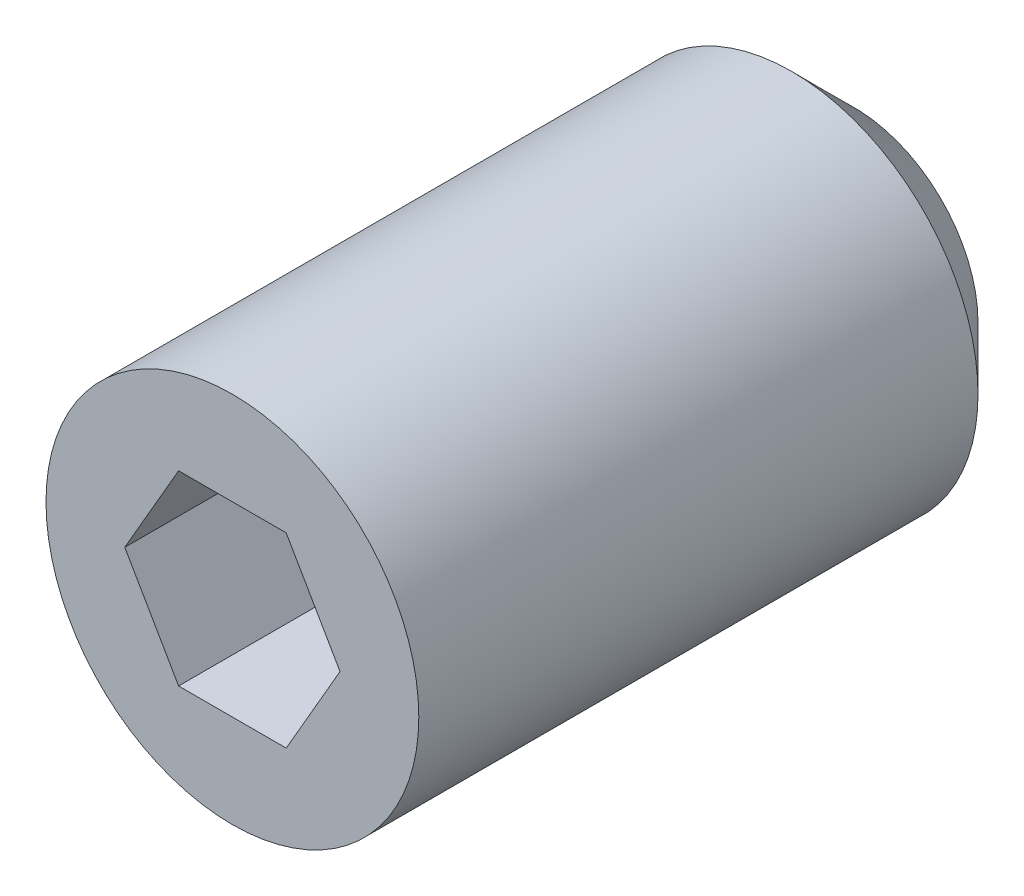
ISO-10303-21;
HEADER;
FILE_DESCRIPTION(('STEP AP214'),'2;1');
FILE_NAME('part.step','',(''),(''),'','','');
FILE_SCHEMA(('AUTOMOTIVE_DESIGN { 1 0 10303 214 1 1 1 1 }'));
ENDSEC;
DATA;
#1=APPLICATION_CONTEXT('core data for automotive mechanical design processes');
#2=APPLICATION_PROTOCOL_DEFINITION('international standard','automotive_design',2000,#1);
#3=PRODUCT_CONTEXT('',#1,'mechanical');
#4=PRODUCT('Part','Part','',(#3));
#5=PRODUCT_RELATED_PRODUCT_CATEGORY('part','',(#4));
#6=PRODUCT_DEFINITION_FORMATION('','',#4);
#7=PRODUCT_DEFINITION_CONTEXT('part definition',#1,'design');
#8=PRODUCT_DEFINITION('design','',#6,#7);
#9=PRODUCT_DEFINITION_SHAPE('','',#8);
#10=(LENGTH_UNIT() NAMED_UNIT(*) SI_UNIT(.MILLI.,.METRE.));
#11=(NAMED_UNIT(*) PLANE_ANGLE_UNIT() SI_UNIT($,.RADIAN.));
#12=(NAMED_UNIT(*) SI_UNIT($,.STERADIAN.) SOLID_ANGLE_UNIT());
#13=UNCERTAINTY_MEASURE_WITH_UNIT(LENGTH_MEASURE(1.E-05),#10,'distance_accuracy_value','');
#14=(GEOMETRIC_REPRESENTATION_CONTEXT(3) GLOBAL_UNCERTAINTY_ASSIGNED_CONTEXT((#13)) GLOBAL_UNIT_ASSIGNED_CONTEXT((#10,
#11,#12)) REPRESENTATION_CONTEXT('',''));
#15=CARTESIAN_POINT('',(0.,0.,0.));
#16=DIRECTION('',(0.,0.,1.));
#17=DIRECTION('',(1.,0.,0.));
#18=AXIS2_PLACEMENT_3D('',#15,#16,#17);
#19=CARTESIAN_POINT('',(0.,0.,-5.));
#20=DIRECTION('',(0.,0.,1.));
#21=DIRECTION('',(1.,0.,0.));
#22=AXIS2_PLACEMENT_3D('',#19,#20,#21);
#23=CYLINDRICAL_SURFACE('',#22,1.5);
#24=CARTESIAN_POINT('',(0.,0.,0.));
#25=DIRECTION('',(0.,0.,1.));
#26=DIRECTION('',(1.,0.,0.));
#27=AXIS2_PLACEMENT_3D('',#24,#25,#26);
#28=CIRCLE('',#27,1.5);
#29=CARTESIAN_POINT('',(1.5,0.,0.));
#30=VERTEX_POINT('',#29);
#31=EDGE_CURVE('E11',#30,#30,#28,.T.);
#32=ORIENTED_EDGE('',*,*,#31,.F.);
#33=EDGE_LOOP('',(#32));
#34=FACE_BOUND('',#33,.T.);
#35=CARTESIAN_POINT('',(0.,0.,-4.50000000000001));
#36=DIRECTION('',(0.,0.,1.));
#37=DIRECTION('',(1.,0.,0.));
#38=AXIS2_PLACEMENT_3D('',#35,#36,#37);
#39=CIRCLE('',#38,1.5);
#40=CARTESIAN_POINT('',(1.5,0.,-4.50000000000001));
#41=VERTEX_POINT('',#40);
#42=EDGE_CURVE('E124',#41,#41,#39,.T.);
#43=ORIENTED_EDGE('',*,*,#42,.T.);
#44=EDGE_LOOP('',(#43));
#45=FACE_BOUND('',#44,.T.);
#46=ADVANCED_FACE('F36',(#34,#45),#23,.T.);
#47=CARTESIAN_POINT('',(0.,0.,0.));
#48=DIRECTION('',(0.,0.,1.));
#49=DIRECTION('',(1.,0.,0.));
#50=AXIS2_PLACEMENT_3D('',#47,#48,#49);
#51=PLANE('',#50);
#52=DIRECTION('',(0.499999999999999,0.866025403784439,0.));
#53=VECTOR('',#52,1.);
#54=CARTESIAN_POINT('',(0.43301270189222,-0.75,0.));
#55=LINE('',#54,#53);
#56=CARTESIAN_POINT('',(0.43301270189222,-0.75,0.));
#57=VERTEX_POINT('',#56);
#58=CARTESIAN_POINT('',(0.866025403784439,0.,0.));
#59=VERTEX_POINT('',#58);
#60=EDGE_CURVE('E50',#57,#59,#55,.T.);
#61=ORIENTED_EDGE('',*,*,#60,.F.);
#62=DIRECTION('',(1.,0.,0.));
#63=VECTOR('',#62,1.);
#64=CARTESIAN_POINT('',(-0.433012701892219,-0.75,0.));
#65=LINE('',#64,#63);
#66=CARTESIAN_POINT('',(-0.433012701892219,-0.75,0.));
#67=VERTEX_POINT('',#66);
#68=EDGE_CURVE('E133',#67,#57,#65,.T.);
#69=ORIENTED_EDGE('',*,*,#68,.F.);
#70=DIRECTION('',(0.5,-0.866025403784439,0.));
#71=VECTOR('',#70,1.);
#72=CARTESIAN_POINT('',(-0.866025403784439,0.,0.));
#73=LINE('',#72,#71);
#74=CARTESIAN_POINT('',(-0.866025403784439,0.,0.));
#75=VERTEX_POINT('',#74);
#76=EDGE_CURVE('E131',#75,#67,#73,.T.);
#77=ORIENTED_EDGE('',*,*,#76,.F.);
#78=DIRECTION('',(-0.499999999999999,-0.866025403784439,0.));
#79=VECTOR('',#78,1.);
#80=CARTESIAN_POINT('',(-0.43301270189222,0.75,0.));
#81=LINE('',#80,#79);
#82=CARTESIAN_POINT('',(-0.43301270189222,0.75,0.));
#83=VERTEX_POINT('',#82);
#84=EDGE_CURVE('E97',#83,#75,#81,.T.);
#85=ORIENTED_EDGE('',*,*,#84,.F.);
#86=DIRECTION('',(-1.,0.,0.));
#87=VECTOR('',#86,1.);
#88=CARTESIAN_POINT('',(0.433012701892219,0.75,0.));
#89=LINE('',#88,#87);
#90=CARTESIAN_POINT('',(0.433012701892219,0.75,0.));
#91=VERTEX_POINT('',#90);
#92=EDGE_CURVE('E127',#91,#83,#89,.T.);
#93=ORIENTED_EDGE('',*,*,#92,.F.);
#94=DIRECTION('',(-0.5,0.866025403784438,0.));
#95=VECTOR('',#94,1.);
#96=CARTESIAN_POINT('',(0.866025403784438,0.,0.));
#97=LINE('',#96,#95);
#98=EDGE_CURVE('E123',#59,#91,#97,.T.);
#99=ORIENTED_EDGE('',*,*,#98,.F.);
#100=EDGE_LOOP('',(#61,#69,#77,#85,#93,#99));
#101=FACE_BOUND('',#100,.T.);
#102=ORIENTED_EDGE('',*,*,#31,.T.);
#103=EDGE_LOOP('',(#102));
#104=FACE_BOUND('',#103,.T.);
#105=ADVANCED_FACE('F145',(#101,#104),#51,.T.);
#106=CARTESIAN_POINT('',(0.43301270189222,-0.75,-1.2));
#107=DIRECTION('',(0.866025403784439,-0.499999999999999,0.));
#108=DIRECTION('',(0.5,0.866025403784439,0.));
#109=AXIS2_PLACEMENT_3D('',#106,#107,#108);
#110=PLANE('',#109);
#111=ORIENTED_EDGE('',*,*,#60,.T.);
#112=DIRECTION('',(0.,0.,1.));
#113=VECTOR('',#112,1.);
#114=CARTESIAN_POINT('',(0.866025403784438,0.,-1.2));
#115=LINE('',#114,#113);
#116=CARTESIAN_POINT('',(0.866025403784438,0.,-1.2));
#117=VERTEX_POINT('',#116);
#118=EDGE_CURVE('E79',#117,#59,#115,.T.);
#119=ORIENTED_EDGE('',*,*,#118,.F.);
#120=DIRECTION('',(0.499999999999999,0.866025403784439,0.));
#121=VECTOR('',#120,1.);
#122=CARTESIAN_POINT('',(0.43301270189222,-0.75,-1.2));
#123=LINE('',#122,#121);
#124=CARTESIAN_POINT('',(0.43301270189222,-0.75,-1.2));
#125=VERTEX_POINT('',#124);
#126=EDGE_CURVE('E135',#125,#117,#123,.T.);
#127=ORIENTED_EDGE('',*,*,#126,.F.);
#128=DIRECTION('',(0.,0.,1.));
#129=VECTOR('',#128,1.);
#130=CARTESIAN_POINT('',(0.43301270189222,-0.75,-1.2));
#131=LINE('',#130,#129);
#132=EDGE_CURVE('E43',#125,#57,#131,.T.);
#133=ORIENTED_EDGE('',*,*,#132,.T.);
#134=EDGE_LOOP('',(#111,#119,#127,#133));
#135=FACE_BOUND('',#134,.T.);
#136=ADVANCED_FACE('F174',(#135),#110,.F.);
#137=CARTESIAN_POINT('',(-0.433012701892219,-0.75,-1.2));
#138=DIRECTION('',(0.,-1.,0.));
#139=DIRECTION('',(1.,0.,0.));
#140=AXIS2_PLACEMENT_3D('',#137,#138,#139);
#141=PLANE('',#140);
#142=ORIENTED_EDGE('',*,*,#68,.T.);
#143=ORIENTED_EDGE('',*,*,#132,.F.);
#144=DIRECTION('',(1.,0.,0.));
#145=VECTOR('',#144,1.);
#146=CARTESIAN_POINT('',(-0.433012701892219,-0.75,-1.2));
#147=LINE('',#146,#145);
#148=CARTESIAN_POINT('',(-0.433012701892219,-0.75,-1.2));
#149=VERTEX_POINT('',#148);
#150=EDGE_CURVE('E109',#149,#125,#147,.T.);
#151=ORIENTED_EDGE('',*,*,#150,.F.);
#152=DIRECTION('',(0.,0.,1.));
#153=VECTOR('',#152,1.);
#154=CARTESIAN_POINT('',(-0.433012701892219,-0.75,-1.2));
#155=LINE('',#154,#153);
#156=EDGE_CURVE('E101',#149,#67,#155,.T.);
#157=ORIENTED_EDGE('',*,*,#156,.T.);
#158=EDGE_LOOP('',(#142,#143,#151,#157));
#159=FACE_BOUND('',#158,.T.);
#160=ADVANCED_FACE('F181',(#159),#141,.F.);
#161=CARTESIAN_POINT('',(-0.866025403784439,0.,-1.2));
#162=DIRECTION('',(-0.866025403784439,-0.5,0.));
#163=DIRECTION('',(0.5,-0.866025403784439,0.));
#164=AXIS2_PLACEMENT_3D('',#161,#162,#163);
#165=PLANE('',#164);
#166=ORIENTED_EDGE('',*,*,#76,.T.);
#167=ORIENTED_EDGE('',*,*,#156,.F.);
#168=DIRECTION('',(0.5,-0.866025403784439,0.));
#169=VECTOR('',#168,1.);
#170=CARTESIAN_POINT('',(-0.866025403784439,0.,-1.2));
#171=LINE('',#170,#169);
#172=CARTESIAN_POINT('',(-0.866025403784439,0.,-1.2));
#173=VERTEX_POINT('',#172);
#174=EDGE_CURVE('E105',#173,#149,#171,.T.);
#175=ORIENTED_EDGE('',*,*,#174,.F.);
#176=DIRECTION('',(0.,0.,1.));
#177=VECTOR('',#176,1.);
#178=CARTESIAN_POINT('',(-0.866025403784439,0.,-1.2));
#179=LINE('',#178,#177);
#180=EDGE_CURVE('E90',#173,#75,#179,.T.);
#181=ORIENTED_EDGE('',*,*,#180,.T.);
#182=EDGE_LOOP('',(#166,#167,#175,#181));
#183=FACE_BOUND('',#182,.T.);
#184=ADVANCED_FACE('F106',(#183),#165,.F.);
#185=CARTESIAN_POINT('',(-0.43301270189222,0.75,-1.2));
#186=DIRECTION('',(-0.866025403784439,0.5,0.));
#187=DIRECTION('',(-0.5,-0.866025403784439,0.));
#188=AXIS2_PLACEMENT_3D('',#185,#186,#187);
#189=PLANE('',#188);
#190=ORIENTED_EDGE('',*,*,#84,.T.);
#191=ORIENTED_EDGE('',*,*,#180,.F.);
#192=DIRECTION('',(-0.499999999999999,-0.866025403784439,0.));
#193=VECTOR('',#192,1.);
#194=CARTESIAN_POINT('',(-0.43301270189222,0.75,-1.2));
#195=LINE('',#194,#193);
#196=CARTESIAN_POINT('',(-0.43301270189222,0.75,-1.2));
#197=VERTEX_POINT('',#196);
#198=EDGE_CURVE('E94',#197,#173,#195,.T.);
#199=ORIENTED_EDGE('',*,*,#198,.F.);
#200=DIRECTION('',(0.,0.,1.));
#201=VECTOR('',#200,1.);
#202=CARTESIAN_POINT('',(-0.43301270189222,0.75,-1.2));
#203=LINE('',#202,#201);
#204=EDGE_CURVE('E102',#197,#83,#203,.T.);
#205=ORIENTED_EDGE('',*,*,#204,.T.);
#206=EDGE_LOOP('',(#190,#191,#199,#205));
#207=FACE_BOUND('',#206,.T.);
#208=ADVANCED_FACE('F92',(#207),#189,.F.);
#209=CARTESIAN_POINT('',(0.433012701892219,0.75,-1.2));
#210=DIRECTION('',(0.,1.,0.));
#211=DIRECTION('',(0.,0.,1.));
#212=AXIS2_PLACEMENT_3D('',#209,#210,#211);
#213=PLANE('',#212);
#214=ORIENTED_EDGE('',*,*,#92,.T.);
#215=ORIENTED_EDGE('',*,*,#204,.F.);
#216=DIRECTION('',(-1.,0.,0.));
#217=VECTOR('',#216,1.);
#218=CARTESIAN_POINT('',(0.433012701892219,0.75,-1.2));
#219=LINE('',#218,#217);
#220=CARTESIAN_POINT('',(0.433012701892219,0.75,-1.2));
#221=VERTEX_POINT('',#220);
#222=EDGE_CURVE('E115',#221,#197,#219,.T.);
#223=ORIENTED_EDGE('',*,*,#222,.F.);
#224=DIRECTION('',(0.,0.,1.));
#225=VECTOR('',#224,1.);
#226=CARTESIAN_POINT('',(0.433012701892219,0.75,-1.2));
#227=LINE('',#226,#225);
#228=EDGE_CURVE('E139',#221,#91,#227,.T.);
#229=ORIENTED_EDGE('',*,*,#228,.T.);
#230=EDGE_LOOP('',(#214,#215,#223,#229));
#231=FACE_BOUND('',#230,.T.);
#232=ADVANCED_FACE('F149',(#231),#213,.F.);
#233=CARTESIAN_POINT('',(0.866025403784438,0.,-1.2));
#234=DIRECTION('',(0.866025403784439,0.5,0.));
#235=DIRECTION('',(-0.5,0.866025403784439,0.));
#236=AXIS2_PLACEMENT_3D('',#233,#234,#235);
#237=PLANE('',#236);
#238=ORIENTED_EDGE('',*,*,#98,.T.);
#239=ORIENTED_EDGE('',*,*,#228,.F.);
#240=DIRECTION('',(-0.5,0.866025403784438,0.));
#241=VECTOR('',#240,1.);
#242=CARTESIAN_POINT('',(0.866025403784438,0.,-1.2));
#243=LINE('',#242,#241);
#244=EDGE_CURVE('E117',#117,#221,#243,.T.);
#245=ORIENTED_EDGE('',*,*,#244,.F.);
#246=ORIENTED_EDGE('',*,*,#118,.T.);
#247=EDGE_LOOP('',(#238,#239,#245,#246));
#248=FACE_BOUND('',#247,.T.);
#249=ADVANCED_FACE('F142',(#248),#237,.F.);
#250=CARTESIAN_POINT('',(0.,0.,-1.2));
#251=DIRECTION('',(0.,0.,1.));
#252=DIRECTION('',(1.,0.,0.));
#253=AXIS2_PLACEMENT_3D('',#250,#251,#252);
#254=PLANE('',#253);
#255=ORIENTED_EDGE('',*,*,#126,.T.);
#256=ORIENTED_EDGE('',*,*,#244,.T.);
#257=ORIENTED_EDGE('',*,*,#222,.T.);
#258=ORIENTED_EDGE('',*,*,#198,.T.);
#259=ORIENTED_EDGE('',*,*,#174,.T.);
#260=ORIENTED_EDGE('',*,*,#150,.T.);
#261=EDGE_LOOP('',(#255,#256,#257,#258,#259,#260));
#262=FACE_BOUND('',#261,.T.);
#263=ADVANCED_FACE('F112',(#262),#254,.T.);
#264=CARTESIAN_POINT('',(0.,0.,-4.50000000000001));
#265=DIRECTION('',(0.,0.,1.));
#266=DIRECTION('',(1.,0.,0.));
#267=AXIS2_PLACEMENT_3D('',#264,#265,#266);
#268=CONICAL_SURFACE('',#267,1.5,0.785398163397454);
#269=CARTESIAN_POINT('',(0.,0.,-5.));
#270=DIRECTION('',(0.,0.,1.));
#271=DIRECTION('',(1.,0.,0.));
#272=AXIS2_PLACEMENT_3D('',#269,#270,#271);
#273=CIRCLE('',#272,1.);
#274=CARTESIAN_POINT('',(1.,0.,-5.));
#275=VERTEX_POINT('',#274);
#276=EDGE_CURVE('E154',#275,#275,#273,.T.);
#277=ORIENTED_EDGE('',*,*,#276,.T.);
#278=EDGE_LOOP('',(#277));
#279=FACE_BOUND('',#278,.T.);
#280=ORIENTED_EDGE('',*,*,#42,.F.);
#281=EDGE_LOOP('',(#280));
#282=FACE_BOUND('',#281,.T.);
#283=ADVANCED_FACE('F158',(#279,#282),#268,.T.);
#284=CARTESIAN_POINT('',(0.,0.,-5.));
#285=DIRECTION('',(0.,0.,1.));
#286=DIRECTION('',(1.,0.,0.));
#287=AXIS2_PLACEMENT_3D('',#284,#285,#286);
#288=PLANE('',#287);
#289=ORIENTED_EDGE('',*,*,#276,.F.);
#290=EDGE_LOOP('',(#289));
#291=FACE_BOUND('',#290,.T.);
#292=ADVANCED_FACE('F161',(#291),#288,.F.);
#293=CLOSED_SHELL('',(#46,#105,#136,#160,#184,#208,#232,#249,#263,#283,#292));
#294=MANIFOLD_SOLID_BREP('B2',#293);
#295=ADVANCED_BREP_SHAPE_REPRESENTATION('',(#18,#294),#14);
#296=SHAPE_DEFINITION_REPRESENTATION(#9,#295);
ENDSEC;
END-ISO-10303-21;
